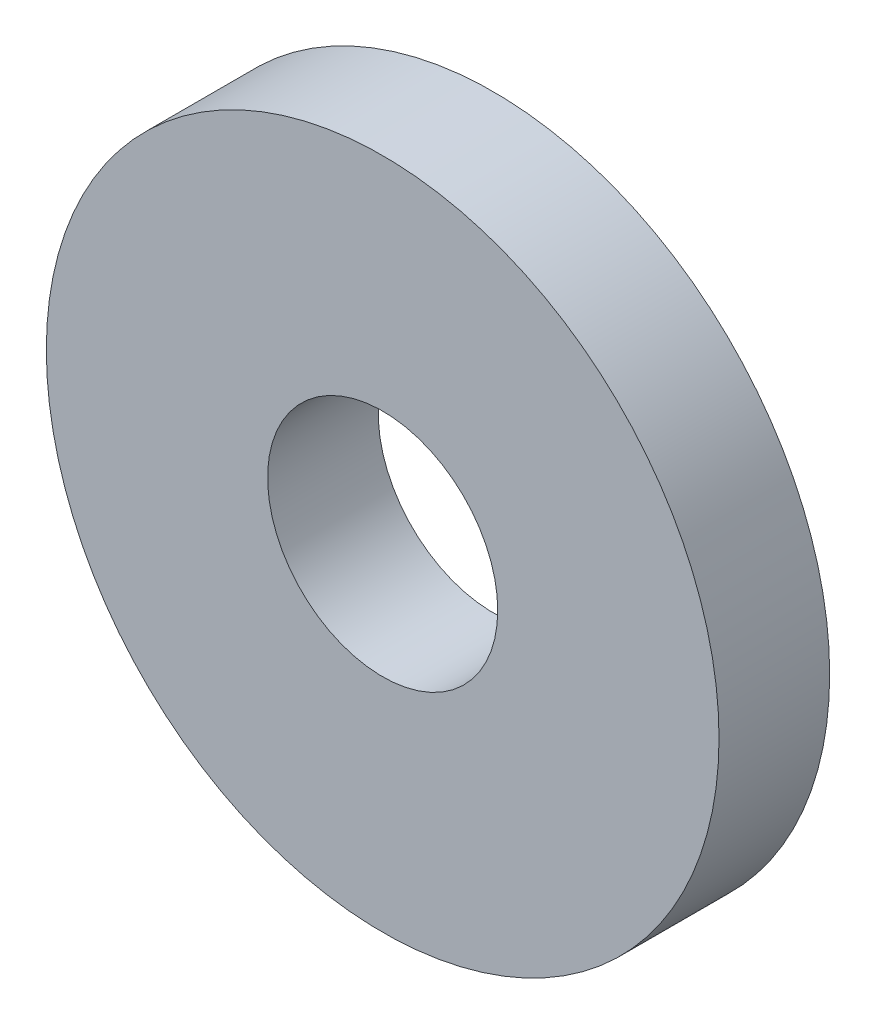
ISO-10303-21;
HEADER;
FILE_DESCRIPTION(('STEP AP214'),'2;1');
FILE_NAME('part.step','',(''),(''),'','','');
FILE_SCHEMA(('AUTOMOTIVE_DESIGN { 1 0 10303 214 1 1 1 1 }'));
ENDSEC;
DATA;
#1=APPLICATION_CONTEXT('core data for automotive mechanical design processes');
#2=APPLICATION_PROTOCOL_DEFINITION('international standard','automotive_design',2000,#1);
#3=PRODUCT_CONTEXT('',#1,'mechanical');
#4=PRODUCT('Part','Part','',(#3));
#5=PRODUCT_RELATED_PRODUCT_CATEGORY('part','',(#4));
#6=PRODUCT_DEFINITION_FORMATION('','',#4);
#7=PRODUCT_DEFINITION_CONTEXT('part definition',#1,'design');
#8=PRODUCT_DEFINITION('design','',#6,#7);
#9=PRODUCT_DEFINITION_SHAPE('','',#8);
#10=(LENGTH_UNIT() NAMED_UNIT(*) SI_UNIT(.MILLI.,.METRE.));
#11=(NAMED_UNIT(*) PLANE_ANGLE_UNIT() SI_UNIT($,.RADIAN.));
#12=(NAMED_UNIT(*) SI_UNIT($,.STERADIAN.) SOLID_ANGLE_UNIT());
#13=UNCERTAINTY_MEASURE_WITH_UNIT(LENGTH_MEASURE(1.E-05),#10,'distance_accuracy_value','');
#14=(GEOMETRIC_REPRESENTATION_CONTEXT(3) GLOBAL_UNCERTAINTY_ASSIGNED_CONTEXT((#13)) GLOBAL_UNIT_ASSIGNED_CONTEXT((#10,
#11,#12)) REPRESENTATION_CONTEXT('',''));
#15=CARTESIAN_POINT('',(0.,0.,0.));
#16=DIRECTION('',(0.,0.,1.));
#17=DIRECTION('',(1.,0.,0.));
#18=AXIS2_PLACEMENT_3D('',#15,#16,#17);
#19=CARTESIAN_POINT('',(0.,0.,3.175));
#20=DIRECTION('',(0.,0.,1.));
#21=DIRECTION('',(1.,0.,0.));
#22=AXIS2_PLACEMENT_3D('',#19,#20,#21);
#23=PLANE('',#22);
#24=CARTESIAN_POINT('',(0.,0.,3.175));
#25=DIRECTION('',(0.,0.,1.));
#26=DIRECTION('',(1.,0.,0.));
#27=AXIS2_PLACEMENT_3D('',#24,#25,#26);
#28=CIRCLE('',#27,9.652);
#29=CARTESIAN_POINT('',(9.652,0.,3.175));
#30=VERTEX_POINT('',#29);
#31=EDGE_CURVE('E10',#30,#30,#28,.T.);
#32=ORIENTED_EDGE('',*,*,#31,.T.);
#33=EDGE_LOOP('',(#32));
#34=FACE_BOUND('',#33,.T.);
#35=CARTESIAN_POINT('',(0.,0.,3.175));
#36=DIRECTION('',(0.,0.,1.));
#37=DIRECTION('',(1.,0.,0.));
#38=AXIS2_PLACEMENT_3D('',#35,#36,#37);
#39=CIRCLE('',#38,3.302);
#40=CARTESIAN_POINT('',(3.302,0.,3.175));
#41=VERTEX_POINT('',#40);
#42=EDGE_CURVE('E47',#41,#41,#39,.T.);
#43=ORIENTED_EDGE('',*,*,#42,.F.);
#44=EDGE_LOOP('',(#43));
#45=FACE_BOUND('',#44,.T.);
#46=ADVANCED_FACE('F36',(#34,#45),#23,.T.);
#47=CARTESIAN_POINT('',(0.,0.,0.));
#48=DIRECTION('',(0.,0.,1.));
#49=DIRECTION('',(1.,0.,0.));
#50=AXIS2_PLACEMENT_3D('',#47,#48,#49);
#51=PLANE('',#50);
#52=CARTESIAN_POINT('',(0.,0.,0.));
#53=DIRECTION('',(0.,0.,1.));
#54=DIRECTION('',(1.,0.,0.));
#55=AXIS2_PLACEMENT_3D('',#52,#53,#54);
#56=CIRCLE('',#55,9.652);
#57=CARTESIAN_POINT('',(9.652,0.,0.));
#58=VERTEX_POINT('',#57);
#59=EDGE_CURVE('E40',#58,#58,#56,.T.);
#60=ORIENTED_EDGE('',*,*,#59,.F.);
#61=EDGE_LOOP('',(#60));
#62=FACE_BOUND('',#61,.T.);
#63=CARTESIAN_POINT('',(0.,0.,0.));
#64=DIRECTION('',(0.,0.,1.));
#65=DIRECTION('',(1.,0.,0.));
#66=AXIS2_PLACEMENT_3D('',#63,#64,#65);
#67=CIRCLE('',#66,3.302);
#68=CARTESIAN_POINT('',(3.302,0.,0.));
#69=VERTEX_POINT('',#68);
#70=EDGE_CURVE('E49',#69,#69,#67,.T.);
#71=ORIENTED_EDGE('',*,*,#70,.T.);
#72=EDGE_LOOP('',(#71));
#73=FACE_BOUND('',#72,.T.);
#74=ADVANCED_FACE('F59',(#62,#73),#51,.F.);
#75=CARTESIAN_POINT('',(0.,0.,3.175));
#76=DIRECTION('',(0.,0.,-1.));
#77=DIRECTION('',(-1.,0.,0.));
#78=AXIS2_PLACEMENT_3D('',#75,#76,#77);
#79=CYLINDRICAL_SURFACE('',#78,9.652);
#80=ORIENTED_EDGE('',*,*,#31,.F.);
#81=EDGE_LOOP('',(#80));
#82=FACE_BOUND('',#81,.T.);
#83=ORIENTED_EDGE('',*,*,#59,.T.);
#84=EDGE_LOOP('',(#83));
#85=FACE_BOUND('',#84,.T.);
#86=ADVANCED_FACE('F38',(#82,#85),#79,.T.);
#87=CARTESIAN_POINT('',(0.,0.,3.175));
#88=DIRECTION('',(0.,0.,-1.));
#89=DIRECTION('',(-1.,0.,0.));
#90=AXIS2_PLACEMENT_3D('',#87,#88,#89);
#91=CYLINDRICAL_SURFACE('',#90,3.302);
#92=ORIENTED_EDGE('',*,*,#42,.T.);
#93=EDGE_LOOP('',(#92));
#94=FACE_BOUND('',#93,.T.);
#95=ORIENTED_EDGE('',*,*,#70,.F.);
#96=EDGE_LOOP('',(#95));
#97=FACE_BOUND('',#96,.T.);
#98=ADVANCED_FACE('F55',(#94,#97),#91,.F.);
#99=CLOSED_SHELL('',(#46,#74,#86,#98));
#100=MANIFOLD_SOLID_BREP('B2',#99);
#101=ADVANCED_BREP_SHAPE_REPRESENTATION('',(#18,#100),#14);
#102=SHAPE_DEFINITION_REPRESENTATION(#9,#101);
ENDSEC;
END-ISO-10303-21;
